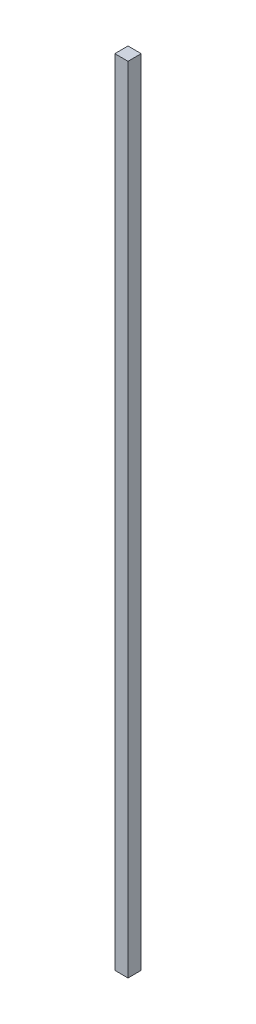
ISO-10303-21;
HEADER;
FILE_DESCRIPTION(('STEP AP214'),'2;1');
FILE_NAME('part.step','',(''),(''),'','','');
FILE_SCHEMA(('AUTOMOTIVE_DESIGN { 1 0 10303 214 1 1 1 1 }'));
ENDSEC;
DATA;
#1=APPLICATION_CONTEXT('core data for automotive mechanical design processes');
#2=APPLICATION_PROTOCOL_DEFINITION('international standard','automotive_design',2000,#1);
#3=PRODUCT_CONTEXT('',#1,'mechanical');
#4=PRODUCT('Part','Part','',(#3));
#5=PRODUCT_RELATED_PRODUCT_CATEGORY('part','',(#4));
#6=PRODUCT_DEFINITION_FORMATION('','',#4);
#7=PRODUCT_DEFINITION_CONTEXT('part definition',#1,'design');
#8=PRODUCT_DEFINITION('design','',#6,#7);
#9=PRODUCT_DEFINITION_SHAPE('','',#8);
#10=(LENGTH_UNIT() NAMED_UNIT(*) SI_UNIT(.MILLI.,.METRE.));
#11=(NAMED_UNIT(*) PLANE_ANGLE_UNIT() SI_UNIT($,.RADIAN.));
#12=(NAMED_UNIT(*) SI_UNIT($,.STERADIAN.) SOLID_ANGLE_UNIT());
#13=UNCERTAINTY_MEASURE_WITH_UNIT(LENGTH_MEASURE(1.E-05),#10,'distance_accuracy_value','');
#14=(GEOMETRIC_REPRESENTATION_CONTEXT(3) GLOBAL_UNCERTAINTY_ASSIGNED_CONTEXT((#13)) GLOBAL_UNIT_ASSIGNED_CONTEXT((#10,
#11,#12)) REPRESENTATION_CONTEXT('',''));
#15=CARTESIAN_POINT('',(0.,0.,0.));
#16=DIRECTION('',(0.,0.,1.));
#17=DIRECTION('',(1.,0.,0.));
#18=AXIS2_PLACEMENT_3D('',#15,#16,#17);
#19=CARTESIAN_POINT('',(0.,1524.,0.));
#20=DIRECTION('',(1.,0.,0.));
#21=DIRECTION('',(0.,0.,-1.));
#22=AXIS2_PLACEMENT_3D('',#19,#20,#21);
#23=PLANE('',#22);
#24=DIRECTION('',(0.,0.,1.));
#25=VECTOR('',#24,1.);
#26=CARTESIAN_POINT('',(0.,0.,0.));
#27=LINE('',#26,#25);
#28=CARTESIAN_POINT('',(0.,0.,0.));
#29=VERTEX_POINT('',#28);
#30=CARTESIAN_POINT('',(0.,0.,25.4));
#31=VERTEX_POINT('',#30);
#32=EDGE_CURVE('E95',#29,#31,#27,.T.);
#33=ORIENTED_EDGE('',*,*,#32,.T.);
#34=DIRECTION('',(0.,-1.,0.));
#35=VECTOR('',#34,1.);
#36=CARTESIAN_POINT('',(0.,1524.,25.4));
#37=LINE('',#36,#35);
#38=CARTESIAN_POINT('',(0.,1524.,25.4));
#39=VERTEX_POINT('',#38);
#40=EDGE_CURVE('E11',#39,#31,#37,.T.);
#41=ORIENTED_EDGE('',*,*,#40,.F.);
#42=DIRECTION('',(0.,0.,1.));
#43=VECTOR('',#42,1.);
#44=CARTESIAN_POINT('',(0.,1524.,0.));
#45=LINE('',#44,#43);
#46=CARTESIAN_POINT('',(0.,1524.,0.));
#47=VERTEX_POINT('',#46);
#48=EDGE_CURVE('E81',#47,#39,#45,.T.);
#49=ORIENTED_EDGE('',*,*,#48,.F.);
#50=DIRECTION('',(0.,-1.,0.));
#51=VECTOR('',#50,1.);
#52=CARTESIAN_POINT('',(0.,1524.,0.));
#53=LINE('',#52,#51);
#54=EDGE_CURVE('E48',#47,#29,#53,.T.);
#55=ORIENTED_EDGE('',*,*,#54,.T.);
#56=EDGE_LOOP('',(#33,#41,#49,#55));
#57=FACE_BOUND('',#56,.T.);
#58=ADVANCED_FACE('F32',(#57),#23,.F.);
#59=CARTESIAN_POINT('',(0.,1524.,25.4));
#60=DIRECTION('',(0.,0.,-1.));
#61=DIRECTION('',(-1.,0.,0.));
#62=AXIS2_PLACEMENT_3D('',#59,#60,#61);
#63=PLANE('',#62);
#64=DIRECTION('',(1.,0.,0.));
#65=VECTOR('',#64,1.);
#66=CARTESIAN_POINT('',(0.,0.,25.4));
#67=LINE('',#66,#65);
#68=CARTESIAN_POINT('',(25.4,0.,25.4));
#69=VERTEX_POINT('',#68);
#70=EDGE_CURVE('E86',#31,#69,#67,.T.);
#71=ORIENTED_EDGE('',*,*,#70,.T.);
#72=DIRECTION('',(0.,-1.,0.));
#73=VECTOR('',#72,1.);
#74=CARTESIAN_POINT('',(25.4,1524.,25.4));
#75=LINE('',#74,#73);
#76=CARTESIAN_POINT('',(25.4,1524.,25.4));
#77=VERTEX_POINT('',#76);
#78=EDGE_CURVE('E40',#77,#69,#75,.T.);
#79=ORIENTED_EDGE('',*,*,#78,.F.);
#80=DIRECTION('',(1.,0.,0.));
#81=VECTOR('',#80,1.);
#82=CARTESIAN_POINT('',(0.,1524.,25.4));
#83=LINE('',#82,#81);
#84=EDGE_CURVE('E73',#39,#77,#83,.T.);
#85=ORIENTED_EDGE('',*,*,#84,.F.);
#86=ORIENTED_EDGE('',*,*,#40,.T.);
#87=EDGE_LOOP('',(#71,#79,#85,#86));
#88=FACE_BOUND('',#87,.T.);
#89=ADVANCED_FACE('F85',(#88),#63,.F.);
#90=CARTESIAN_POINT('',(25.4,1524.,0.));
#91=DIRECTION('',(1.,0.,0.));
#92=DIRECTION('',(0.,0.,-1.));
#93=AXIS2_PLACEMENT_3D('',#90,#91,#92);
#94=PLANE('',#93);
#95=DIRECTION('',(0.,0.,1.));
#96=VECTOR('',#95,1.);
#97=CARTESIAN_POINT('',(25.4,0.,0.));
#98=LINE('',#97,#96);
#99=CARTESIAN_POINT('',(25.4,0.,0.));
#100=VERTEX_POINT('',#99);
#101=EDGE_CURVE('E98',#100,#69,#98,.T.);
#102=ORIENTED_EDGE('',*,*,#101,.F.);
#103=DIRECTION('',(0.,-1.,0.));
#104=VECTOR('',#103,1.);
#105=CARTESIAN_POINT('',(25.4,1524.,0.));
#106=LINE('',#105,#104);
#107=CARTESIAN_POINT('',(25.4,1524.,0.));
#108=VERTEX_POINT('',#107);
#109=EDGE_CURVE('E62',#108,#100,#106,.T.);
#110=ORIENTED_EDGE('',*,*,#109,.F.);
#111=DIRECTION('',(0.,0.,1.));
#112=VECTOR('',#111,1.);
#113=CARTESIAN_POINT('',(25.4,1524.,0.));
#114=LINE('',#113,#112);
#115=EDGE_CURVE('E80',#108,#77,#114,.T.);
#116=ORIENTED_EDGE('',*,*,#115,.T.);
#117=ORIENTED_EDGE('',*,*,#78,.T.);
#118=EDGE_LOOP('',(#102,#110,#116,#117));
#119=FACE_BOUND('',#118,.T.);
#120=ADVANCED_FACE('F89',(#119),#94,.T.);
#121=CARTESIAN_POINT('',(0.,1524.,0.));
#122=DIRECTION('',(0.,0.,-1.));
#123=DIRECTION('',(-1.,0.,0.));
#124=AXIS2_PLACEMENT_3D('',#121,#122,#123);
#125=PLANE('',#124);
#126=DIRECTION('',(1.,0.,0.));
#127=VECTOR('',#126,1.);
#128=CARTESIAN_POINT('',(0.,0.,0.));
#129=LINE('',#128,#127);
#130=EDGE_CURVE('E100',#29,#100,#129,.T.);
#131=ORIENTED_EDGE('',*,*,#130,.F.);
#132=ORIENTED_EDGE('',*,*,#54,.F.);
#133=DIRECTION('',(1.,0.,0.));
#134=VECTOR('',#133,1.);
#135=CARTESIAN_POINT('',(0.,1524.,0.));
#136=LINE('',#135,#134);
#137=EDGE_CURVE('E90',#47,#108,#136,.T.);
#138=ORIENTED_EDGE('',*,*,#137,.T.);
#139=ORIENTED_EDGE('',*,*,#109,.T.);
#140=EDGE_LOOP('',(#131,#132,#138,#139));
#141=FACE_BOUND('',#140,.T.);
#142=ADVANCED_FACE('F106',(#141),#125,.T.);
#143=CARTESIAN_POINT('',(0.,1524.,0.));
#144=DIRECTION('',(0.,1.,0.));
#145=DIRECTION('',(0.,0.,1.));
#146=AXIS2_PLACEMENT_3D('',#143,#144,#145);
#147=PLANE('',#146);
#148=ORIENTED_EDGE('',*,*,#48,.T.);
#149=ORIENTED_EDGE('',*,*,#84,.T.);
#150=ORIENTED_EDGE('',*,*,#115,.F.);
#151=ORIENTED_EDGE('',*,*,#137,.F.);
#152=EDGE_LOOP('',(#148,#149,#150,#151));
#153=FACE_BOUND('',#152,.T.);
#154=ADVANCED_FACE('F77',(#153),#147,.T.);
#155=CARTESIAN_POINT('',(0.,0.,0.));
#156=DIRECTION('',(0.,1.,0.));
#157=DIRECTION('',(0.,0.,1.));
#158=AXIS2_PLACEMENT_3D('',#155,#156,#157);
#159=PLANE('',#158);
#160=ORIENTED_EDGE('',*,*,#32,.F.);
#161=ORIENTED_EDGE('',*,*,#130,.T.);
#162=ORIENTED_EDGE('',*,*,#101,.T.);
#163=ORIENTED_EDGE('',*,*,#70,.F.);
#164=EDGE_LOOP('',(#160,#161,#162,#163));
#165=FACE_BOUND('',#164,.T.);
#166=ADVANCED_FACE('F105',(#165),#159,.F.);
#167=CLOSED_SHELL('',(#58,#89,#120,#142,#154,#166));
#168=MANIFOLD_SOLID_BREP('B2',#167);
#169=ADVANCED_BREP_SHAPE_REPRESENTATION('',(#18,#168),#14);
#170=SHAPE_DEFINITION_REPRESENTATION(#9,#169);
ENDSEC;
END-ISO-10303-21;
